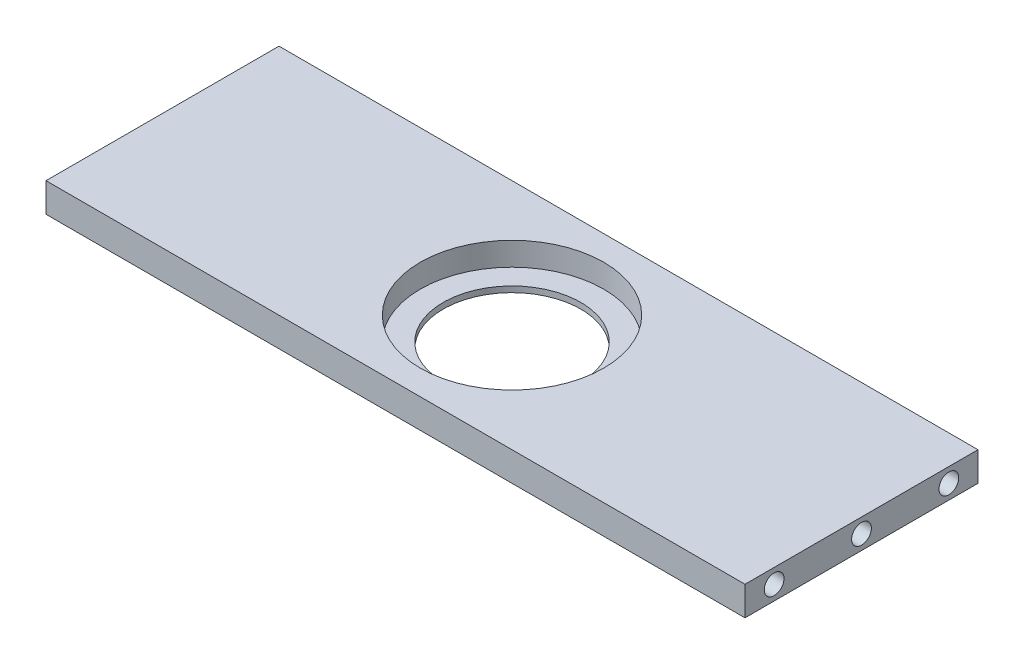
ISO-10303-21;
HEADER;
FILE_DESCRIPTION(('STEP AP214'),'2;1');
FILE_NAME('part.step','',(''),(''),'','','');
FILE_SCHEMA(('AUTOMOTIVE_DESIGN { 1 0 10303 214 1 1 1 1 }'));
ENDSEC;
DATA;
#1=APPLICATION_CONTEXT('core data for automotive mechanical design processes');
#2=APPLICATION_PROTOCOL_DEFINITION('international standard','automotive_design',2000,#1);
#3=PRODUCT_CONTEXT('',#1,'mechanical');
#4=PRODUCT('Part','Part','',(#3));
#5=PRODUCT_RELATED_PRODUCT_CATEGORY('part','',(#4));
#6=PRODUCT_DEFINITION_FORMATION('','',#4);
#7=PRODUCT_DEFINITION_CONTEXT('part definition',#1,'design');
#8=PRODUCT_DEFINITION('design','',#6,#7);
#9=PRODUCT_DEFINITION_SHAPE('','',#8);
#10=(LENGTH_UNIT() NAMED_UNIT(*) SI_UNIT(.MILLI.,.METRE.));
#11=(NAMED_UNIT(*) PLANE_ANGLE_UNIT() SI_UNIT($,.RADIAN.));
#12=(NAMED_UNIT(*) SI_UNIT($,.STERADIAN.) SOLID_ANGLE_UNIT());
#13=UNCERTAINTY_MEASURE_WITH_UNIT(LENGTH_MEASURE(1.E-05),#10,'distance_accuracy_value','');
#14=(GEOMETRIC_REPRESENTATION_CONTEXT(3) GLOBAL_UNCERTAINTY_ASSIGNED_CONTEXT((#13)) GLOBAL_UNIT_ASSIGNED_CONTEXT((#10,
#11,#12)) REPRESENTATION_CONTEXT('',''));
#15=CARTESIAN_POINT('',(0.,0.,0.));
#16=DIRECTION('',(0.,0.,1.));
#17=DIRECTION('',(1.,0.,0.));
#18=AXIS2_PLACEMENT_3D('',#15,#16,#17);
#19=CARTESIAN_POINT('',(76.2,-6.35,25.4));
#20=DIRECTION('',(1.,0.,0.));
#21=DIRECTION('',(0.,0.,-1.));
#22=AXIS2_PLACEMENT_3D('',#19,#20,#21);
#23=PLANE('',#22);
#24=CARTESIAN_POINT('',(76.2,-3.175,19.05));
#25=DIRECTION('',(-1.,0.,0.));
#26=DIRECTION('',(0.,0.,1.));
#27=AXIS2_PLACEMENT_3D('',#24,#25,#26);
#28=CIRCLE('',#27,2.15265);
#29=CARTESIAN_POINT('',(76.2,-3.175,21.20265));
#30=VERTEX_POINT('',#29);
#31=EDGE_CURVE('E196',#30,#30,#28,.T.);
#32=ORIENTED_EDGE('',*,*,#31,.T.);
#33=EDGE_LOOP('',(#32));
#34=FACE_BOUND('',#33,.T.);
#35=CARTESIAN_POINT('',(76.2,-3.175,-19.05));
#36=DIRECTION('',(-1.,0.,0.));
#37=DIRECTION('',(0.,0.,-1.));
#38=AXIS2_PLACEMENT_3D('',#35,#36,#37);
#39=CIRCLE('',#38,2.15265);
#40=CARTESIAN_POINT('',(76.2,-3.175,-21.20265));
#41=VERTEX_POINT('',#40);
#42=EDGE_CURVE('E207',#41,#41,#39,.T.);
#43=ORIENTED_EDGE('',*,*,#42,.T.);
#44=EDGE_LOOP('',(#43));
#45=FACE_BOUND('',#44,.T.);
#46=CARTESIAN_POINT('',(76.2,-3.175,0.));
#47=DIRECTION('',(-1.,0.,0.));
#48=DIRECTION('',(0.,0.,1.));
#49=AXIS2_PLACEMENT_3D('',#46,#47,#48);
#50=CIRCLE('',#49,2.15265);
#51=CARTESIAN_POINT('',(76.2,-3.175,2.15265));
#52=VERTEX_POINT('',#51);
#53=EDGE_CURVE('E195',#52,#52,#50,.T.);
#54=ORIENTED_EDGE('',*,*,#53,.T.);
#55=EDGE_LOOP('',(#54));
#56=FACE_BOUND('',#55,.T.);
#57=DIRECTION('',(0.,0.,-1.));
#58=VECTOR('',#57,1.);
#59=CARTESIAN_POINT('',(76.2,0.,25.4));
#60=LINE('',#59,#58);
#61=CARTESIAN_POINT('',(76.2,0.,25.4));
#62=VERTEX_POINT('',#61);
#63=CARTESIAN_POINT('',(76.2,0.,-25.4));
#64=VERTEX_POINT('',#63);
#65=EDGE_CURVE('E97',#62,#64,#60,.T.);
#66=ORIENTED_EDGE('',*,*,#65,.F.);
#67=DIRECTION('',(0.,1.,0.));
#68=VECTOR('',#67,1.);
#69=CARTESIAN_POINT('',(76.2,-6.35,25.4));
#70=LINE('',#69,#68);
#71=CARTESIAN_POINT('',(76.2,-6.35,25.4));
#72=VERTEX_POINT('',#71);
#73=EDGE_CURVE('E11',#72,#62,#70,.T.);
#74=ORIENTED_EDGE('',*,*,#73,.F.);
#75=DIRECTION('',(0.,0.,-1.));
#76=VECTOR('',#75,1.);
#77=CARTESIAN_POINT('',(76.2,-6.35,25.4));
#78=LINE('',#77,#76);
#79=CARTESIAN_POINT('',(76.2,-6.35,-25.4));
#80=VERTEX_POINT('',#79);
#81=EDGE_CURVE('E90',#72,#80,#78,.T.);
#82=ORIENTED_EDGE('',*,*,#81,.T.);
#83=DIRECTION('',(0.,1.,0.));
#84=VECTOR('',#83,1.);
#85=CARTESIAN_POINT('',(76.2,-6.35,-25.4));
#86=LINE('',#85,#84);
#87=EDGE_CURVE('E35',#80,#64,#86,.T.);
#88=ORIENTED_EDGE('',*,*,#87,.T.);
#89=EDGE_LOOP('',(#66,#74,#82,#88));
#90=FACE_BOUND('',#89,.T.);
#91=ADVANCED_FACE('F32',(#34,#45,#56,#90),#23,.T.);
#92=CARTESIAN_POINT('',(-76.2,-6.35,25.4));
#93=DIRECTION('',(0.,0.,1.));
#94=DIRECTION('',(1.,0.,0.));
#95=AXIS2_PLACEMENT_3D('',#92,#93,#94);
#96=PLANE('',#95);
#97=DIRECTION('',(1.,0.,0.));
#98=VECTOR('',#97,1.);
#99=CARTESIAN_POINT('',(-76.2,0.,25.4));
#100=LINE('',#99,#98);
#101=CARTESIAN_POINT('',(-76.2,0.,25.4));
#102=VERTEX_POINT('',#101);
#103=EDGE_CURVE('E92',#102,#62,#100,.T.);
#104=ORIENTED_EDGE('',*,*,#103,.F.);
#105=DIRECTION('',(0.,1.,0.));
#106=VECTOR('',#105,1.);
#107=CARTESIAN_POINT('',(-76.2,-6.35,25.4));
#108=LINE('',#107,#106);
#109=CARTESIAN_POINT('',(-76.2,-6.35,25.4));
#110=VERTEX_POINT('',#109);
#111=EDGE_CURVE('E41',#110,#102,#108,.T.);
#112=ORIENTED_EDGE('',*,*,#111,.F.);
#113=DIRECTION('',(1.,0.,0.));
#114=VECTOR('',#113,1.);
#115=CARTESIAN_POINT('',(-76.2,-6.35,25.4));
#116=LINE('',#115,#114);
#117=EDGE_CURVE('E87',#110,#72,#116,.T.);
#118=ORIENTED_EDGE('',*,*,#117,.T.);
#119=ORIENTED_EDGE('',*,*,#73,.T.);
#120=EDGE_LOOP('',(#104,#112,#118,#119));
#121=FACE_BOUND('',#120,.T.);
#122=ADVANCED_FACE('F108',(#121),#96,.T.);
#123=CARTESIAN_POINT('',(-76.2,-6.35,25.4));
#124=DIRECTION('',(-1.,0.,0.));
#125=DIRECTION('',(0.,0.,1.));
#126=AXIS2_PLACEMENT_3D('',#123,#124,#125);
#127=PLANE('',#126);
#128=CARTESIAN_POINT('',(-76.2,-3.175,19.05));
#129=DIRECTION('',(-1.,0.,0.));
#130=DIRECTION('',(0.,0.,1.));
#131=AXIS2_PLACEMENT_3D('',#128,#129,#130);
#132=CIRCLE('',#131,2.15265);
#133=CARTESIAN_POINT('',(-76.2,-3.175,21.20265));
#134=VERTEX_POINT('',#133);
#135=EDGE_CURVE('E217',#134,#134,#132,.T.);
#136=ORIENTED_EDGE('',*,*,#135,.F.);
#137=EDGE_LOOP('',(#136));
#138=FACE_BOUND('',#137,.T.);
#139=CARTESIAN_POINT('',(-76.2,-3.175,-19.05));
#140=DIRECTION('',(-1.,0.,0.));
#141=DIRECTION('',(0.,0.,-1.));
#142=AXIS2_PLACEMENT_3D('',#139,#140,#141);
#143=CIRCLE('',#142,2.15265);
#144=CARTESIAN_POINT('',(-76.2,-3.175,-21.20265));
#145=VERTEX_POINT('',#144);
#146=EDGE_CURVE('E211',#145,#145,#143,.T.);
#147=ORIENTED_EDGE('',*,*,#146,.F.);
#148=EDGE_LOOP('',(#147));
#149=FACE_BOUND('',#148,.T.);
#150=CARTESIAN_POINT('',(-76.2,-3.175,0.));
#151=DIRECTION('',(-1.,0.,0.));
#152=DIRECTION('',(0.,0.,1.));
#153=AXIS2_PLACEMENT_3D('',#150,#151,#152);
#154=CIRCLE('',#153,2.15265);
#155=CARTESIAN_POINT('',(-76.2,-3.175,2.15265));
#156=VERTEX_POINT('',#155);
#157=EDGE_CURVE('E216',#156,#156,#154,.T.);
#158=ORIENTED_EDGE('',*,*,#157,.F.);
#159=EDGE_LOOP('',(#158));
#160=FACE_BOUND('',#159,.T.);
#161=DIRECTION('',(0.,0.,1.));
#162=VECTOR('',#161,1.);
#163=CARTESIAN_POINT('',(-76.2,0.,25.4));
#164=LINE('',#163,#162);
#165=CARTESIAN_POINT('',(-76.2,0.,-25.4));
#166=VERTEX_POINT('',#165);
#167=EDGE_CURVE('E82',#166,#102,#164,.T.);
#168=ORIENTED_EDGE('',*,*,#167,.F.);
#169=DIRECTION('',(0.,1.,0.));
#170=VECTOR('',#169,1.);
#171=CARTESIAN_POINT('',(-76.2,-6.35,-25.4));
#172=LINE('',#171,#170);
#173=CARTESIAN_POINT('',(-76.2,-6.35,-25.4));
#174=VERTEX_POINT('',#173);
#175=EDGE_CURVE('E77',#174,#166,#172,.T.);
#176=ORIENTED_EDGE('',*,*,#175,.F.);
#177=DIRECTION('',(0.,0.,1.));
#178=VECTOR('',#177,1.);
#179=CARTESIAN_POINT('',(-76.2,-6.35,25.4));
#180=LINE('',#179,#178);
#181=EDGE_CURVE('E80',#174,#110,#180,.T.);
#182=ORIENTED_EDGE('',*,*,#181,.T.);
#183=ORIENTED_EDGE('',*,*,#111,.T.);
#184=EDGE_LOOP('',(#168,#176,#182,#183));
#185=FACE_BOUND('',#184,.T.);
#186=ADVANCED_FACE('F79',(#138,#149,#160,#185),#127,.T.);
#187=CARTESIAN_POINT('',(-76.2,-6.35,-25.4));
#188=DIRECTION('',(0.,0.,-1.));
#189=DIRECTION('',(-1.,0.,0.));
#190=AXIS2_PLACEMENT_3D('',#187,#188,#189);
#191=PLANE('',#190);
#192=DIRECTION('',(-1.,0.,0.));
#193=VECTOR('',#192,1.);
#194=CARTESIAN_POINT('',(-76.2,0.,-25.4));
#195=LINE('',#194,#193);
#196=EDGE_CURVE('E100',#64,#166,#195,.T.);
#197=ORIENTED_EDGE('',*,*,#196,.F.);
#198=ORIENTED_EDGE('',*,*,#87,.F.);
#199=DIRECTION('',(-1.,0.,0.));
#200=VECTOR('',#199,1.);
#201=CARTESIAN_POINT('',(-76.2,-6.35,-25.4));
#202=LINE('',#201,#200);
#203=EDGE_CURVE('E86',#80,#174,#202,.T.);
#204=ORIENTED_EDGE('',*,*,#203,.T.);
#205=ORIENTED_EDGE('',*,*,#175,.T.);
#206=EDGE_LOOP('',(#197,#198,#204,#205));
#207=FACE_BOUND('',#206,.T.);
#208=ADVANCED_FACE('F89',(#207),#191,.T.);
#209=CARTESIAN_POINT('',(0.,-6.35,0.));
#210=DIRECTION('',(0.,-1.,0.));
#211=DIRECTION('',(0.,0.,-1.));
#212=AXIS2_PLACEMENT_3D('',#209,#210,#211);
#213=PLANE('',#212);
#214=CARTESIAN_POINT('',(0.,-6.35,0.));
#215=DIRECTION('',(0.,1.,0.));
#216=DIRECTION('',(0.,0.,1.));
#217=AXIS2_PLACEMENT_3D('',#214,#215,#216);
#218=CIRCLE('',#217,15.);
#219=CARTESIAN_POINT('',(0.,-6.35,15.));
#220=VERTEX_POINT('',#219);
#221=EDGE_CURVE('E231',#220,#220,#218,.T.);
#222=ORIENTED_EDGE('',*,*,#221,.T.);
#223=EDGE_LOOP('',(#222));
#224=FACE_BOUND('',#223,.T.);
#225=ORIENTED_EDGE('',*,*,#81,.F.);
#226=ORIENTED_EDGE('',*,*,#117,.F.);
#227=ORIENTED_EDGE('',*,*,#181,.F.);
#228=ORIENTED_EDGE('',*,*,#203,.F.);
#229=EDGE_LOOP('',(#225,#226,#227,#228));
#230=FACE_BOUND('',#229,.T.);
#231=ADVANCED_FACE('F85',(#224,#230),#213,.T.);
#232=CARTESIAN_POINT('',(0.,0.,0.));
#233=DIRECTION('',(0.,-1.,0.));
#234=DIRECTION('',(0.,0.,-1.));
#235=AXIS2_PLACEMENT_3D('',#232,#233,#234);
#236=PLANE('',#235);
#237=CARTESIAN_POINT('',(0.,0.,0.));
#238=DIRECTION('',(0.,1.,0.));
#239=DIRECTION('',(0.,0.,1.));
#240=AXIS2_PLACEMENT_3D('',#237,#238,#239);
#241=CIRCLE('',#240,20.);
#242=CARTESIAN_POINT('',(0.,0.,20.));
#243=VERTEX_POINT('',#242);
#244=EDGE_CURVE('E233',#243,#243,#241,.T.);
#245=ORIENTED_EDGE('',*,*,#244,.F.);
#246=EDGE_LOOP('',(#245));
#247=FACE_BOUND('',#246,.T.);
#248=ORIENTED_EDGE('',*,*,#65,.T.);
#249=ORIENTED_EDGE('',*,*,#196,.T.);
#250=ORIENTED_EDGE('',*,*,#167,.T.);
#251=ORIENTED_EDGE('',*,*,#103,.T.);
#252=EDGE_LOOP('',(#248,#249,#250,#251));
#253=FACE_BOUND('',#252,.T.);
#254=ADVANCED_FACE('F107',(#247,#253),#236,.F.);
#255=CARTESIAN_POINT('',(0.,-5.08,0.));
#256=DIRECTION('',(0.,1.,0.));
#257=DIRECTION('',(0.,0.,1.));
#258=AXIS2_PLACEMENT_3D('',#255,#256,#257);
#259=CYLINDRICAL_SURFACE('',#258,20.);
#260=CARTESIAN_POINT('',(0.,-5.08,0.));
#261=DIRECTION('',(0.,1.,0.));
#262=DIRECTION('',(0.,0.,1.));
#263=AXIS2_PLACEMENT_3D('',#260,#261,#262);
#264=CIRCLE('',#263,20.);
#265=CARTESIAN_POINT('',(0.,-5.08,20.));
#266=VERTEX_POINT('',#265);
#267=EDGE_CURVE('E101',#266,#266,#264,.T.);
#268=ORIENTED_EDGE('',*,*,#267,.F.);
#269=EDGE_LOOP('',(#268));
#270=FACE_BOUND('',#269,.T.);
#271=ORIENTED_EDGE('',*,*,#244,.T.);
#272=EDGE_LOOP('',(#271));
#273=FACE_BOUND('',#272,.T.);
#274=ADVANCED_FACE('F128',(#270,#273),#259,.F.);
#275=CARTESIAN_POINT('',(0.,-5.08,0.));
#276=DIRECTION('',(0.,1.,0.));
#277=DIRECTION('',(0.,0.,1.));
#278=AXIS2_PLACEMENT_3D('',#275,#276,#277);
#279=PLANE('',#278);
#280=CARTESIAN_POINT('',(0.,-5.08,0.));
#281=DIRECTION('',(0.,1.,0.));
#282=DIRECTION('',(0.,0.,1.));
#283=AXIS2_PLACEMENT_3D('',#280,#281,#282);
#284=CIRCLE('',#283,15.);
#285=CARTESIAN_POINT('',(0.,-5.08,15.));
#286=VERTEX_POINT('',#285);
#287=EDGE_CURVE('E228',#286,#286,#284,.T.);
#288=ORIENTED_EDGE('',*,*,#287,.F.);
#289=EDGE_LOOP('',(#288));
#290=FACE_BOUND('',#289,.T.);
#291=ORIENTED_EDGE('',*,*,#267,.T.);
#292=EDGE_LOOP('',(#291));
#293=FACE_BOUND('',#292,.T.);
#294=ADVANCED_FACE('F134',(#290,#293),#279,.T.);
#295=CARTESIAN_POINT('',(0.,-6.35,0.));
#296=DIRECTION('',(0.,1.,0.));
#297=DIRECTION('',(0.,0.,1.));
#298=AXIS2_PLACEMENT_3D('',#295,#296,#297);
#299=CYLINDRICAL_SURFACE('',#298,15.);
#300=ORIENTED_EDGE('',*,*,#221,.F.);
#301=EDGE_LOOP('',(#300));
#302=FACE_BOUND('',#301,.T.);
#303=ORIENTED_EDGE('',*,*,#287,.T.);
#304=EDGE_LOOP('',(#303));
#305=FACE_BOUND('',#304,.T.);
#306=ADVANCED_FACE('F138',(#302,#305),#299,.F.);
#307=CARTESIAN_POINT('',(-50.8,-3.175,0.));
#308=DIRECTION('',(-1.,0.,0.));
#309=DIRECTION('',(0.,0.,1.));
#310=AXIS2_PLACEMENT_3D('',#307,#308,#309);
#311=CYLINDRICAL_SURFACE('',#310,2.15265);
#312=CARTESIAN_POINT('',(-50.8,-3.175,0.));
#313=DIRECTION('',(-1.,0.,0.));
#314=DIRECTION('',(0.,0.,1.));
#315=AXIS2_PLACEMENT_3D('',#312,#313,#314);
#316=CIRCLE('',#315,2.15265);
#317=CARTESIAN_POINT('',(-50.8,-3.175,2.15265));
#318=VERTEX_POINT('',#317);
#319=EDGE_CURVE('E225',#318,#318,#316,.T.);
#320=ORIENTED_EDGE('',*,*,#319,.F.);
#321=EDGE_LOOP('',(#320));
#322=FACE_BOUND('',#321,.T.);
#323=ORIENTED_EDGE('',*,*,#157,.T.);
#324=EDGE_LOOP('',(#323));
#325=FACE_BOUND('',#324,.T.);
#326=ADVANCED_FACE('F142',(#322,#325),#311,.F.);
#327=CARTESIAN_POINT('',(-50.8,-3.175,0.));
#328=DIRECTION('',(-1.,0.,0.));
#329=DIRECTION('',(0.,0.,1.));
#330=AXIS2_PLACEMENT_3D('',#327,#328,#329);
#331=PLANE('',#330);
#332=ORIENTED_EDGE('',*,*,#319,.T.);
#333=EDGE_LOOP('',(#332));
#334=FACE_BOUND('',#333,.T.);
#335=ADVANCED_FACE('F146',(#334),#331,.T.);
#336=CARTESIAN_POINT('',(-50.8,-3.175,-19.05));
#337=DIRECTION('',(-1.,0.,0.));
#338=DIRECTION('',(0.,0.,1.));
#339=AXIS2_PLACEMENT_3D('',#336,#337,#338);
#340=CYLINDRICAL_SURFACE('',#339,2.15265);
#341=CARTESIAN_POINT('',(-50.8,-3.175,-19.05));
#342=DIRECTION('',(-1.,0.,0.));
#343=DIRECTION('',(0.,0.,-1.));
#344=AXIS2_PLACEMENT_3D('',#341,#342,#343);
#345=CIRCLE('',#344,2.15265);
#346=CARTESIAN_POINT('',(-50.8,-3.175,-21.20265));
#347=VERTEX_POINT('',#346);
#348=EDGE_CURVE('E220',#347,#347,#345,.T.);
#349=ORIENTED_EDGE('',*,*,#348,.F.);
#350=EDGE_LOOP('',(#349));
#351=FACE_BOUND('',#350,.T.);
#352=ORIENTED_EDGE('',*,*,#146,.T.);
#353=EDGE_LOOP('',(#352));
#354=FACE_BOUND('',#353,.T.);
#355=ADVANCED_FACE('F150',(#351,#354),#340,.F.);
#356=CARTESIAN_POINT('',(-50.8,-3.175,-19.05));
#357=DIRECTION('',(1.,0.,0.));
#358=DIRECTION('',(0.,0.,-1.));
#359=AXIS2_PLACEMENT_3D('',#356,#357,#358);
#360=PLANE('',#359);
#361=ORIENTED_EDGE('',*,*,#348,.T.);
#362=EDGE_LOOP('',(#361));
#363=FACE_BOUND('',#362,.T.);
#364=ADVANCED_FACE('F154',(#363),#360,.F.);
#365=CARTESIAN_POINT('',(-50.8,-3.175,19.05));
#366=DIRECTION('',(-1.,0.,0.));
#367=DIRECTION('',(0.,0.,1.));
#368=AXIS2_PLACEMENT_3D('',#365,#366,#367);
#369=CYLINDRICAL_SURFACE('',#368,2.15265);
#370=CARTESIAN_POINT('',(-50.8,-3.175,19.05));
#371=DIRECTION('',(-1.,0.,0.));
#372=DIRECTION('',(0.,0.,1.));
#373=AXIS2_PLACEMENT_3D('',#370,#371,#372);
#374=CIRCLE('',#373,2.15265);
#375=CARTESIAN_POINT('',(-50.8,-3.175,21.20265));
#376=VERTEX_POINT('',#375);
#377=EDGE_CURVE('E213',#376,#376,#374,.T.);
#378=ORIENTED_EDGE('',*,*,#377,.F.);
#379=EDGE_LOOP('',(#378));
#380=FACE_BOUND('',#379,.T.);
#381=ORIENTED_EDGE('',*,*,#135,.T.);
#382=EDGE_LOOP('',(#381));
#383=FACE_BOUND('',#382,.T.);
#384=ADVANCED_FACE('F158',(#380,#383),#369,.F.);
#385=CARTESIAN_POINT('',(-50.8,-3.175,19.05));
#386=DIRECTION('',(-1.,0.,0.));
#387=DIRECTION('',(0.,0.,1.));
#388=AXIS2_PLACEMENT_3D('',#385,#386,#387);
#389=PLANE('',#388);
#390=ORIENTED_EDGE('',*,*,#377,.T.);
#391=EDGE_LOOP('',(#390));
#392=FACE_BOUND('',#391,.T.);
#393=ADVANCED_FACE('F162',(#392),#389,.T.);
#394=CARTESIAN_POINT('',(50.8,-3.175,0.));
#395=DIRECTION('',(1.,0.,0.));
#396=DIRECTION('',(0.,0.,-1.));
#397=AXIS2_PLACEMENT_3D('',#394,#395,#396);
#398=CYLINDRICAL_SURFACE('',#397,2.15265);
#399=CARTESIAN_POINT('',(50.8,-3.175,0.));
#400=DIRECTION('',(-1.,0.,0.));
#401=DIRECTION('',(0.,0.,1.));
#402=AXIS2_PLACEMENT_3D('',#399,#400,#401);
#403=CIRCLE('',#402,2.15265);
#404=CARTESIAN_POINT('',(50.8,-3.175,2.15265));
#405=VERTEX_POINT('',#404);
#406=EDGE_CURVE('E199',#405,#405,#403,.T.);
#407=ORIENTED_EDGE('',*,*,#406,.T.);
#408=EDGE_LOOP('',(#407));
#409=FACE_BOUND('',#408,.T.);
#410=ORIENTED_EDGE('',*,*,#53,.F.);
#411=EDGE_LOOP('',(#410));
#412=FACE_BOUND('',#411,.T.);
#413=ADVANCED_FACE('F166',(#409,#412),#398,.F.);
#414=CARTESIAN_POINT('',(50.8,-3.175,0.));
#415=DIRECTION('',(1.,0.,0.));
#416=DIRECTION('',(0.,0.,1.));
#417=AXIS2_PLACEMENT_3D('',#414,#415,#416);
#418=PLANE('',#417);
#419=ORIENTED_EDGE('',*,*,#406,.F.);
#420=EDGE_LOOP('',(#419));
#421=FACE_BOUND('',#420,.T.);
#422=ADVANCED_FACE('F170',(#421),#418,.T.);
#423=CARTESIAN_POINT('',(50.8,-3.175,-19.05));
#424=DIRECTION('',(1.,0.,0.));
#425=DIRECTION('',(0.,0.,-1.));
#426=AXIS2_PLACEMENT_3D('',#423,#424,#425);
#427=CYLINDRICAL_SURFACE('',#426,2.15265);
#428=CARTESIAN_POINT('',(50.8,-3.175,-19.05));
#429=DIRECTION('',(-1.,0.,0.));
#430=DIRECTION('',(0.,0.,-1.));
#431=AXIS2_PLACEMENT_3D('',#428,#429,#430);
#432=CIRCLE('',#431,2.15265);
#433=CARTESIAN_POINT('',(50.8,-3.175,-21.20265));
#434=VERTEX_POINT('',#433);
#435=EDGE_CURVE('E202',#434,#434,#432,.T.);
#436=ORIENTED_EDGE('',*,*,#435,.T.);
#437=EDGE_LOOP('',(#436));
#438=FACE_BOUND('',#437,.T.);
#439=ORIENTED_EDGE('',*,*,#42,.F.);
#440=EDGE_LOOP('',(#439));
#441=FACE_BOUND('',#440,.T.);
#442=ADVANCED_FACE('F174',(#438,#441),#427,.F.);
#443=CARTESIAN_POINT('',(50.8,-3.175,-19.05));
#444=DIRECTION('',(-1.,0.,0.));
#445=DIRECTION('',(0.,0.,-1.));
#446=AXIS2_PLACEMENT_3D('',#443,#444,#445);
#447=PLANE('',#446);
#448=ORIENTED_EDGE('',*,*,#435,.F.);
#449=EDGE_LOOP('',(#448));
#450=FACE_BOUND('',#449,.T.);
#451=ADVANCED_FACE('F178',(#450),#447,.F.);
#452=CARTESIAN_POINT('',(50.8,-3.175,19.05));
#453=DIRECTION('',(1.,0.,0.));
#454=DIRECTION('',(0.,0.,-1.));
#455=AXIS2_PLACEMENT_3D('',#452,#453,#454);
#456=CYLINDRICAL_SURFACE('',#455,2.15265);
#457=CARTESIAN_POINT('',(50.8,-3.175,19.05));
#458=DIRECTION('',(-1.,0.,0.));
#459=DIRECTION('',(0.,0.,1.));
#460=AXIS2_PLACEMENT_3D('',#457,#458,#459);
#461=CIRCLE('',#460,2.15265);
#462=CARTESIAN_POINT('',(50.8,-3.175,21.20265));
#463=VERTEX_POINT('',#462);
#464=EDGE_CURVE('E194',#463,#463,#461,.T.);
#465=ORIENTED_EDGE('',*,*,#464,.T.);
#466=EDGE_LOOP('',(#465));
#467=FACE_BOUND('',#466,.T.);
#468=ORIENTED_EDGE('',*,*,#31,.F.);
#469=EDGE_LOOP('',(#468));
#470=FACE_BOUND('',#469,.T.);
#471=ADVANCED_FACE('F182',(#467,#470),#456,.F.);
#472=CARTESIAN_POINT('',(50.8,-3.175,19.05));
#473=DIRECTION('',(1.,0.,0.));
#474=DIRECTION('',(0.,0.,1.));
#475=AXIS2_PLACEMENT_3D('',#472,#473,#474);
#476=PLANE('',#475);
#477=ORIENTED_EDGE('',*,*,#464,.F.);
#478=EDGE_LOOP('',(#477));
#479=FACE_BOUND('',#478,.T.);
#480=ADVANCED_FACE('F186',(#479),#476,.T.);
#481=CLOSED_SHELL('',(#91,#122,#186,#208,#231,#254,#274,#294,#306,#326,#335,#355,#364,#384,#393,
#413,#422,#442,#451,#471,#480));
#482=MANIFOLD_SOLID_BREP('B2',#481);
#483=ADVANCED_BREP_SHAPE_REPRESENTATION('',(#18,#482),#14);
#484=SHAPE_DEFINITION_REPRESENTATION(#9,#483);
ENDSEC;
END-ISO-10303-21;
